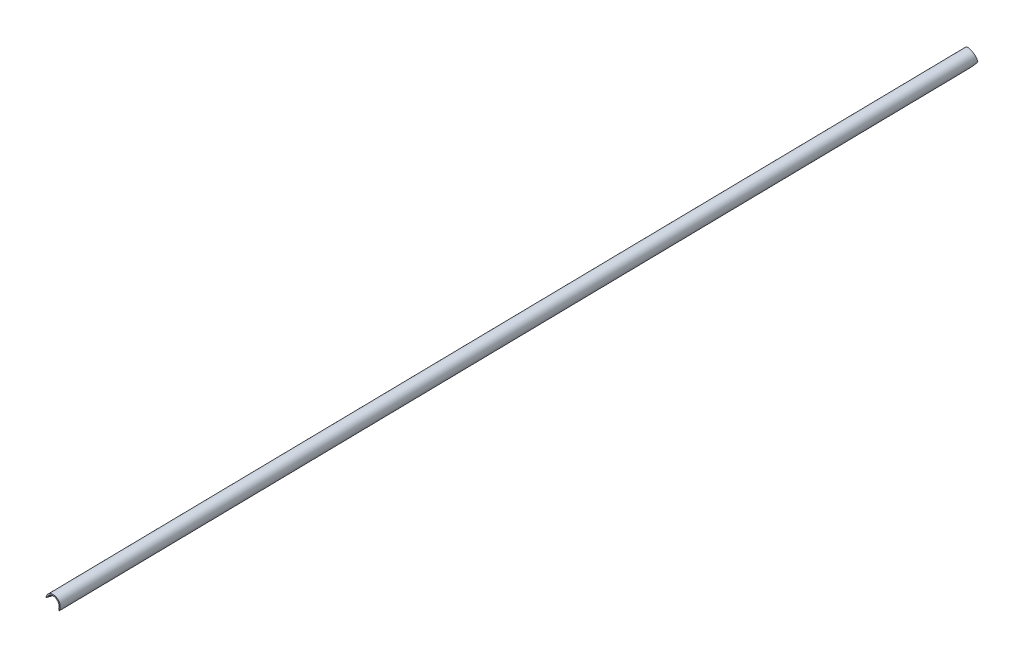
ISO-10303-21;
HEADER;
FILE_DESCRIPTION(('STEP AP214'),'2;1');
FILE_NAME('part.step','',(''),(''),'','','');
FILE_SCHEMA(('AUTOMOTIVE_DESIGN { 1 0 10303 214 1 1 1 1 }'));
ENDSEC;
DATA;
#1=APPLICATION_CONTEXT('core data for automotive mechanical design processes');
#2=APPLICATION_PROTOCOL_DEFINITION('international standard','automotive_design',2000,#1);
#3=PRODUCT_CONTEXT('',#1,'mechanical');
#4=PRODUCT('Part','Part','',(#3));
#5=PRODUCT_RELATED_PRODUCT_CATEGORY('part','',(#4));
#6=PRODUCT_DEFINITION_FORMATION('','',#4);
#7=PRODUCT_DEFINITION_CONTEXT('part definition',#1,'design');
#8=PRODUCT_DEFINITION('design','',#6,#7);
#9=PRODUCT_DEFINITION_SHAPE('','',#8);
#10=(LENGTH_UNIT() NAMED_UNIT(*) SI_UNIT(.MILLI.,.METRE.));
#11=(NAMED_UNIT(*) PLANE_ANGLE_UNIT() SI_UNIT($,.RADIAN.));
#12=(NAMED_UNIT(*) SI_UNIT($,.STERADIAN.) SOLID_ANGLE_UNIT());
#13=UNCERTAINTY_MEASURE_WITH_UNIT(LENGTH_MEASURE(1.E-05),#10,'distance_accuracy_value','');
#14=(GEOMETRIC_REPRESENTATION_CONTEXT(3) GLOBAL_UNCERTAINTY_ASSIGNED_CONTEXT((#13)) GLOBAL_UNIT_ASSIGNED_CONTEXT((#10,
#11,#12)) REPRESENTATION_CONTEXT('',''));
#15=CARTESIAN_POINT('',(0.,0.,0.));
#16=DIRECTION('',(0.,0.,1.));
#17=DIRECTION('',(1.,0.,0.));
#18=AXIS2_PLACEMENT_3D('',#15,#16,#17);
#19=CARTESIAN_POINT('',(325.000000000001,320.,-1580.));
#20=DIRECTION('',(-0.0876619818920292,-0.105194378270435,0.99058039537993));
#21=DIRECTION('',(0.,-0.994408591727349,-0.105600912395825));
#22=AXIS2_PLACEMENT_3D('',#19,#20,#21);
#23=CYLINDRICAL_SURFACE('',#22,7.90000000000002);
#24=CARTESIAN_POINT('',(321.564187869695,308.021197568987,-1542.00957013547));
#25=CARTESIAN_POINT('',(321.513543454168,308.014221116452,-1541.94387154136));
#26=CARTESIAN_POINT('',(321.462273905188,308.007670657862,-1541.87861072624));
#27=CARTESIAN_POINT('',(321.358375195791,307.995510603661,-1541.74908389811));
#28=CARTESIAN_POINT('',(321.305745925539,307.989901084331,-1541.68481796613));
#29=CARTESIAN_POINT('',(321.145587155256,307.974622062816,-1541.4936390251));
#30=CARTESIAN_POINT('',(321.035847760094,307.966510775415,-1541.36842475598));
#31=CARTESIAN_POINT('',(320.810021886063,307.955495394391,-1541.12473709098));
#32=CARTESIAN_POINT('',(320.693970221962,307.952565236482,-1541.00623287388));
#33=CARTESIAN_POINT('',(320.453849860198,307.953258230655,-1540.77775331836));
#34=CARTESIAN_POINT('',(320.329789706347,307.956874506592,-1540.6677691573));
#35=CARTESIAN_POINT('',(320.093766356813,307.971360359894,-1540.47741805793));
#36=CARTESIAN_POINT('',(319.983255633284,307.980914110515,-1540.39517549993));
#37=CARTESIAN_POINT('',(319.754809802187,308.007589782803,-1540.24241845623));
#38=CARTESIAN_POINT('',(319.636862914255,308.024723985584,-1540.17192325866));
#39=CARTESIAN_POINT('',(319.392007604463,308.068811302931,-1540.04684178115));
#40=CARTESIAN_POINT('',(319.264993200791,308.095904603071,-1539.99250372738));
#41=CARTESIAN_POINT('',(319.006087477374,308.161687548452,-1539.90814425322));
#42=CARTESIAN_POINT('',(318.874217781932,308.200330205663,-1539.87802609375));
#43=CARTESIAN_POINT('',(318.646475901313,308.277378620293,-1539.85182899589));
#44=CARTESIAN_POINT('',(318.550472241483,308.313046220552,-1539.84876797863));
#45=CARTESIAN_POINT('',(318.361571674106,308.389830572664,-1539.85928119157));
#46=CARTESIAN_POINT('',(318.268675228716,308.430948130651,-1539.8728578852));
#47=CARTESIAN_POINT('',(318.088959460206,308.516994644617,-1539.91539954483));
#48=CARTESIAN_POINT('',(318.002115050259,308.561905918505,-1539.94429610901));
#49=CARTESIAN_POINT('',(317.835358232615,308.654232636235,-1540.01501749989));
#50=CARTESIAN_POINT('',(317.755450718605,308.70164981055,-1540.0568513599));
#51=CARTESIAN_POINT('',(317.55173564349,308.830017924563,-1540.18220766143));
#52=CARTESIAN_POINT('',(317.434360203123,308.912162946752,-1540.27488799024));
#53=CARTESIAN_POINT('',(317.217294352119,309.077035507662,-1540.47861039872));
#54=CARTESIAN_POINT('',(317.117665485497,309.159764077418,-1540.58971389265));
#55=CARTESIAN_POINT('',(316.911705126935,309.343266534551,-1540.85044749699));
#56=CARTESIAN_POINT('',(316.809055209883,309.443838589794,-1541.00307641182));
#57=CARTESIAN_POINT('',(316.620198248718,309.643205527304,-1541.31943002863));
#58=CARTESIAN_POINT('',(316.534021901744,309.74199678698,-1541.48317468942));
#59=CARTESIAN_POINT('',(316.37412115082,309.938132343311,-1541.81870556109));
#60=CARTESIAN_POINT('',(316.300463496565,310.035466505679,-1541.99052900325));
#61=CARTESIAN_POINT('',(316.163528467873,310.228221840458,-1542.33902831407));
#62=CARTESIAN_POINT('',(316.100242237967,310.323644583143,-1542.51569989115));
#63=CARTESIAN_POINT('',(315.990042685414,310.500082725213,-1542.84855801666));
#64=CARTESIAN_POINT('',(315.942072413931,310.581304003042,-1543.00429012438));
#65=CARTESIAN_POINT('',(315.851496668514,310.742650449879,-1543.31787480215));
#66=CARTESIAN_POINT('',(315.808891682419,310.822775518624,-1543.47572756359));
#67=CARTESIAN_POINT('',(315.687968463006,311.061747060355,-1543.95192964921));
#68=CARTESIAN_POINT('',(315.616586019788,311.2191173018,-1544.27278462225));
#69=CARTESIAN_POINT('',(315.488047359041,311.530942991074,-1544.91948052576));
#70=CARTESIAN_POINT('',(315.430920717273,311.685391774754,-1545.24533035736));
#71=CARTESIAN_POINT('',(315.32835262247,311.99164978551,-1545.9001177331));
#72=CARTESIAN_POINT('',(315.282912452937,312.14345872095,-1546.22905561229));
#73=CARTESIAN_POINT('',(315.201763690695,312.445008275307,-1546.88940315933));
#74=CARTESIAN_POINT('',(315.166063621776,312.594746974432,-1547.2208147331));
#75=CARTESIAN_POINT('',(315.103045408819,312.892404321596,-1547.88525878388));
#76=CARTESIAN_POINT('',(315.075727712541,313.040322872003,-1548.21829134651));
#77=CARTESIAN_POINT('',(315.028457784003,313.334459865675,-1548.88511621988));
#78=CARTESIAN_POINT('',(315.008496304134,313.480680218147,-1549.21890704231));
#79=CARTESIAN_POINT('',(314.975094186203,313.771881457079,-1549.8873542128));
#80=CARTESIAN_POINT('',(314.961653641851,313.916862325698,-1550.22201057322));
#81=CARTESIAN_POINT('',(314.93743575281,314.250377274391,-1550.99522744429));
#82=CARTESIAN_POINT('',(314.92875760826,314.43855591445,-1551.43400702381));
#83=CARTESIAN_POINT('',(314.920452272172,314.813694074632,-1552.31217438879));
#84=CARTESIAN_POINT('',(314.920825277071,315.000653568207,-1552.75156218724));
#85=CARTESIAN_POINT('',(314.929880946846,315.373897161333,-1553.63077183922));
#86=CARTESIAN_POINT('',(314.938567398403,315.560180914277,-1554.0705937993));
#87=CARTESIAN_POINT('',(314.963736332905,315.93245188072,-1554.9501487895));
#88=CARTESIAN_POINT('',(314.980218987057,316.118439087616,-1555.38988181747));
#89=CARTESIAN_POINT('',(315.020655141678,316.490600382779,-1556.26893992611));
#90=CARTESIAN_POINT('',(315.044608871969,316.676774476617,-1556.70826499383));
#91=CARTESIAN_POINT('',(315.09983795457,317.049827048568,-1557.58614575822));
#92=CARTESIAN_POINT('',(315.131113169792,317.236705513427,-1558.02470146914));
#93=CARTESIAN_POINT('',(315.201006217671,317.611706289396,-1558.90052015382));
#94=CARTESIAN_POINT('',(315.239621575935,317.79982816078,-1559.33778351294));
#95=CARTESIAN_POINT('',(315.32443314086,318.17807882493,-1560.2107024008));
#96=CARTESIAN_POINT('',(315.370629238581,318.368207588817,-1560.64635795255));
#97=CARTESIAN_POINT('',(315.459383821423,318.706688723953,-1561.41420813188));
#98=CARTESIAN_POINT('',(315.500281365779,318.854451616527,-1561.74685470869));
#99=CARTESIAN_POINT('',(315.587170451622,319.152128215095,-1562.4105142801));
#100=CARTESIAN_POINT('',(315.633161911114,319.302041886433,-1562.74152730091));
#101=CARTESIAN_POINT('',(315.73076357716,319.604687496808,-1563.40173745229));
#102=CARTESIAN_POINT('',(315.782377918747,319.757421440366,-1563.73093305686));
#103=CARTESIAN_POINT('',(315.891879542648,320.066264186665,-1564.38668700379));
#104=CARTESIAN_POINT('',(315.949766673765,320.222372907988,-1564.71324540952));
#105=CARTESIAN_POINT('',(316.072570248032,320.538285739096,-1565.36196775867));
#106=CARTESIAN_POINT('',(316.13746440642,320.69807693235,-1565.68414216666));
#107=CARTESIAN_POINT('',(316.275733031755,321.022801079188,-1566.32412829168));
#108=CARTESIAN_POINT('',(316.349108549391,321.187734667971,-1566.64193946272));
#109=CARTESIAN_POINT('',(316.506038889183,321.523650259195,-1567.27129662835));
#110=CARTESIAN_POINT('',(316.589580817541,321.694624409104,-1567.58284998688));
#111=CARTESIAN_POINT('',(316.769390293129,322.044064370085,-1568.1979303665));
#112=CARTESIAN_POINT('',(316.86565336107,322.222527529147,-1568.50146016787));
#113=CARTESIAN_POINT('',(317.03977404183,322.527574446397,-1568.99851866715));
#114=CARTESIAN_POINT('',(317.113134273622,322.651714913812,-1569.19511650725));
#115=CARTESIAN_POINT('',(317.268493000282,322.904286038214,-1569.58212025517));
#116=CARTESIAN_POINT('',(317.35049234537,323.03271711661,-1569.77252555113));
#117=CARTESIAN_POINT('',(317.524698031063,323.293938942804,-1570.14537343875));
#118=CARTESIAN_POINT('',(317.616898199481,323.426727020475,-1570.32782075334));
#119=CARTESIAN_POINT('',(317.81343817277,323.696571170977,-1570.68279472544));
#120=CARTESIAN_POINT('',(317.917775875304,323.833626501678,-1570.85532309329));
#121=CARTESIAN_POINT('',(318.122136424406,324.088218207165,-1571.16034427286));
#122=CARTESIAN_POINT('',(318.219998050788,324.20521601251,-1571.29472745451));
#123=CARTESIAN_POINT('',(318.426758284277,324.440811776597,-1571.55325905881));
#124=CARTESIAN_POINT('',(318.535655968938,324.559409600886,-1571.67740833529));
#125=CARTESIAN_POINT('',(318.765292062153,324.796673096401,-1571.91369168391));
#126=CARTESIAN_POINT('',(318.886012764027,324.915338409366,-1572.02584321286));
#127=CARTESIAN_POINT('',(319.140008763392,325.151013733521,-1572.23694344895));
#128=CARTESIAN_POINT('',(319.273283453184,325.26802382452,-1572.33589279461));
#129=CARTESIAN_POINT('',(319.553733775096,325.499133455894,-1572.52053018726));
#130=CARTESIAN_POINT('',(319.701026773492,325.61319597946,-1572.60608685549));
#131=CARTESIAN_POINT('',(320.007889453049,325.834663177607,-1572.76259115367));
#132=CARTESIAN_POINT('',(320.167459630508,325.942067582718,-1572.8335381926));
#133=CARTESIAN_POINT('',(320.497891077838,326.147767991254,-1572.96140574872));
#134=CARTESIAN_POINT('',(320.668761405106,326.246056532685,-1573.018314837));
#135=CARTESIAN_POINT('',(321.020202385543,326.431223479711,-1573.11921295468));
#136=CARTESIAN_POINT('',(321.200772684393,326.51810230168,-1573.16320245564));
#137=CARTESIAN_POINT('',(321.546012402957,326.668295048512,-1573.234879743));
#138=CARTESIAN_POINT('',(321.709709791061,326.733203749989,-1573.26394136073));
#139=CARTESIAN_POINT('',(322.042083429175,326.852202879338,-1573.31463028091));
#140=CARTESIAN_POINT('',(322.210759068786,326.906294627239,-1573.33625849072));
#141=CARTESIAN_POINT('',(322.552028773075,327.003042671768,-1573.37322280117));
#142=CARTESIAN_POINT('',(322.724622966439,327.045698592253,-1573.38855869485));
#143=CARTESIAN_POINT('',(323.072700638628,327.119149581876,-1573.41400563133));
#144=CARTESIAN_POINT('',(323.248184361263,327.149943644742,-1573.42411623088));
#145=CARTESIAN_POINT('',(323.618916948884,327.201897996129,-1573.44087886656));
#146=CARTESIAN_POINT('',(323.814368052329,327.221767177884,-1573.44707707375));
#147=CARTESIAN_POINT('',(324.206299539592,327.246591259928,-1573.45540559328));
#148=CARTESIAN_POINT('',(324.402779971725,327.251545453731,-1573.45753571291));
#149=CARTESIAN_POINT('',(324.795608390269,327.24648913895,-1573.45864507169));
#150=CARTESIAN_POINT('',(324.99195632618,327.236474563523,-1573.45762345447));
#151=CARTESIAN_POINT('',(325.383299993875,327.201537845056,-1573.45316336426));
#152=CARTESIAN_POINT('',(325.578295635871,327.176614721539,-1573.44972473231));
#153=CARTESIAN_POINT('',(325.981389279367,327.109417756135,-1573.44064491127));
#154=CARTESIAN_POINT('',(326.189278917805,327.065909066979,-1573.4348487462));
#155=CARTESIAN_POINT('',(326.600740101494,326.961983640292,-1573.42159740695));
#156=CARTESIAN_POINT('',(326.804311413161,326.901565990624,-1573.41414214328));
#157=CARTESIAN_POINT('',(327.205795045977,326.764231687664,-1573.3978631139));
#158=CARTESIAN_POINT('',(327.403706372238,326.687312153699,-1573.38903910932));
#159=CARTESIAN_POINT('',(327.792488360085,326.517504976575,-1573.37011409738));
#160=CARTESIAN_POINT('',(327.98335910511,326.42461752273,-1573.36001310516));
#161=CARTESIAN_POINT('',(328.360986058217,326.221217885586,-1573.33817892485));
#162=CARTESIAN_POINT('',(328.547551337852,326.110354351985,-1573.32641396676));
#163=CARTESIAN_POINT('',(328.910594779935,325.873355539938,-1573.30109152471));
#164=CARTESIAN_POINT('',(329.087072702476,325.747219898498,-1573.28753399815));
#165=CARTESIAN_POINT('',(329.428659309695,325.480545928243,-1573.25804376897));
#166=CARTESIAN_POINT('',(329.593764914255,325.340003722949,-1573.24211042655));
#167=CARTESIAN_POINT('',(329.91126931104,325.045592121219,-1573.20703909769));
#168=CARTESIAN_POINT('',(330.063668281149,324.891722911413,-1573.18790115612));
#169=CARTESIAN_POINT('',(330.353262921375,324.573266796481,-1573.14550301834));
#170=CARTESIAN_POINT('',(330.490579411069,324.4087848734,-1573.1222801648));
#171=CARTESIAN_POINT('',(330.750388615195,324.069310299793,-1573.07025347427));
#172=CARTESIAN_POINT('',(330.872881151618,323.894317523088,-1573.04144957027));
#173=CARTESIAN_POINT('',(331.101938508419,323.535595033034,-1572.97667163206));
#174=CARTESIAN_POINT('',(331.208513033488,323.351870733825,-1572.94070199803));
#175=CARTESIAN_POINT('',(331.404949176079,322.977586653669,-1572.85976331191));
#176=CARTESIAN_POINT('',(331.494812295126,322.787027488674,-1572.81479506911));
#177=CARTESIAN_POINT('',(331.652082451343,322.413672429715,-1572.71714478522));
#178=CARTESIAN_POINT('',(331.720551251046,322.231149208463,-1572.66513165122));
#179=CARTESIAN_POINT('',(331.842122631752,321.864469750331,-1572.55005424079));
#180=CARTESIAN_POINT('',(331.895226480895,321.680313649513,-1572.48699087708));
#181=CARTESIAN_POINT('',(331.986250584922,321.313083456584,-1572.34871947004));
#182=CARTESIAN_POINT('',(332.024190076921,321.130008285731,-1572.27352698455));
#183=CARTESIAN_POINT('',(332.085710710003,320.76722318045,-1572.11027895624));
#184=CARTESIAN_POINT('',(332.109292952347,320.587512988938,-1572.02222440064));
#185=CARTESIAN_POINT('',(332.141429611617,320.253466077736,-1571.84380576389));
#186=CARTESIAN_POINT('',(332.151366525948,320.098534531157,-1571.75479408003));
#187=CARTESIAN_POINT('',(332.1619915009,319.794374363361,-1571.56706598546));
#188=CARTESIAN_POINT('',(332.1626803894,319.64514523286,-1571.46835044423));
#189=CARTESIAN_POINT('',(332.156045152388,319.353158216363,-1571.26190952918));
#190=CARTESIAN_POINT('',(332.148716977445,319.210403638619,-1571.15417962758));
#191=CARTESIAN_POINT('',(332.127288304009,318.931863552971,-1570.93070559392));
#192=CARTESIAN_POINT('',(332.113186882404,318.796078997791,-1570.8149603713));
#193=CARTESIAN_POINT('',(332.067631557903,318.439498439106,-1570.49346594702));
#194=CARTESIAN_POINT('',(332.030930838373,318.225290381515,-1570.28112893585));
#195=CARTESIAN_POINT('',(331.946209786786,317.815791174138,-1569.84102998402));
#196=CARTESIAN_POINT('',(331.898180408297,317.62051531931,-1569.61325582025));
#197=CARTESIAN_POINT('',(331.794038204674,317.245929653157,-1569.14542623803));
#198=CARTESIAN_POINT('',(331.737897345898,317.066678853835,-1568.9053301706));
#199=CARTESIAN_POINT('',(331.649477106135,316.808532722333,-1568.5388292938));
#200=CARTESIAN_POINT('',(331.61930705665,316.724284225382,-1568.41562188747));
#201=CARTESIAN_POINT('',(331.557757375531,316.559044462794,-1568.1673374967));
#202=CARTESIAN_POINT('',(331.526377755044,316.478053167153,-1568.0422605295));
#203=CARTESIAN_POINT('',(331.437367622877,316.256184353928,-1567.69095521208));
#204=CARTESIAN_POINT('',(331.378598280031,316.118588184516,-1567.4629412853));
#205=CARTESIAN_POINT('',(331.258476194728,315.85151363114,-1567.00285597572));
#206=CARTESIAN_POINT('',(331.197123024413,315.722036600541,-1566.77078392469));
#207=CARTESIAN_POINT('',(331.072286357989,315.469965686755,-1566.30332556274));
#208=CARTESIAN_POINT('',(331.008801657322,315.347375803864,-1566.06793742299));
#209=CARTESIAN_POINT('',(330.880053164849,315.108184790669,-1565.59461147982));
#210=CARTESIAN_POINT('',(330.814789256129,314.991584055379,-1565.35667350946));
#211=CARTESIAN_POINT('',(330.616322819389,314.648930110786,-1564.63856758879));
#212=CARTESIAN_POINT('',(330.480772069463,314.430670349047,-1564.15532626035));
#213=CARTESIAN_POINT('',(330.204378905212,314.010134001396,-1563.18370279125));
#214=CARTESIAN_POINT('',(330.063538116202,313.80785256461,-1562.69532226221));
#215=CARTESIAN_POINT('',(329.775122299999,313.413731675732,-1561.70943275338));
#216=CARTESIAN_POINT('',(329.627488906957,313.222037120707,-1561.21188312223));
#217=CARTESIAN_POINT('',(329.326912795904,312.849297399978,-1560.21437735228));
#218=CARTESIAN_POINT('',(329.173969697547,312.668252999683,-1559.7144210433));
#219=CARTESIAN_POINT('',(328.862871268123,312.315692335021,-1558.71426500678));
#220=CARTESIAN_POINT('',(328.704729530162,312.144153951102,-1558.21406883383));
#221=CARTESIAN_POINT('',(328.382447783288,311.809095498745,-1557.21295171291));
#222=CARTESIAN_POINT('',(328.218308003636,311.645575124394,-1556.71203079334));
#223=CARTESIAN_POINT('',(327.846323760179,311.290427153308,-1555.59895534249));
#224=CARTESIAN_POINT('',(327.636858433962,311.100606654899,-1554.98676426909));
#225=CARTESIAN_POINT('',(327.206721674541,310.731285949181,-1553.76311382535));
#226=CARTESIAN_POINT('',(326.986048957882,310.551786928915,-1553.15165454705));
#227=CARTESIAN_POINT('',(326.530621627523,310.202306036228,-1551.92772169402));
#228=CARTESIAN_POINT('',(326.295805322087,310.032373215892,-1551.31525701031));
#229=CARTESIAN_POINT('',(325.810617026582,309.703610895858,-1550.09371762461));
#230=CARTESIAN_POINT('',(325.560250384558,309.544777618326,-1549.48464183477));
#231=CARTESIAN_POINT('',(325.172463319723,309.31721707057,-1548.57998368413));
#232=CARTESIAN_POINT('',(325.04233872623,309.243736294681,-1548.28246082786));
#233=CARTESIAN_POINT('',(324.77683950109,309.100093673557,-1547.68896170502));
#234=CARTESIAN_POINT('',(324.641465002424,309.029931744354,-1547.39298539949));
#235=CARTESIAN_POINT('',(324.364554982941,308.893202722581,-1546.80255747249));
#236=CARTESIAN_POINT('',(324.2230111232,308.826640786421,-1546.50810855708));
#237=CARTESIAN_POINT('',(323.933024597292,308.69773689938,-1545.92170811541));
#238=CARTESIAN_POINT('',(323.784582400933,308.635394661828,-1545.62975642068));
#239=CARTESIAN_POINT('',(323.480742683189,308.516089693004,-1545.05127527231));
#240=CARTESIAN_POINT('',(323.32540641623,308.459089765056,-1544.76472149214));
#241=CARTESIAN_POINT('',(323.005188158047,308.350941212668,-1544.19590287779));
#242=CARTESIAN_POINT('',(322.840307448922,308.299791805066,-1543.91363747396));
#243=CARTESIAN_POINT('',(322.499169697861,308.204878715527,-1543.35557309317));
#244=CARTESIAN_POINT('',(322.322938885637,308.161098793819,-1543.07976108232));
#245=CARTESIAN_POINT('',(322.047520352362,308.102602026855,-1542.67262442792));
#246=CARTESIAN_POINT('',(321.953895806526,308.084302633829,-1542.5380448781));
#247=CARTESIAN_POINT('',(321.762394139002,308.050511032186,-1542.27159451607));
#248=CARTESIAN_POINT('',(321.664517708531,308.03501836939,-1542.13972326867));
#249=CARTESIAN_POINT('',(321.564187869695,308.021197568987,-1542.00957013547));
#250=B_SPLINE_CURVE_WITH_KNOTS('',3,(#24,#25,#26,#27,#28,#29,#30,#31,#32,#33,#34,#35,#36,#37,
#38,#39,#40,#41,#42,#43,#44,#45,#46,#47,#48,#49,#50,#51,#52,#53,#54,#55,#56,#57,#58,#59,#60,#61,
#62,#63,#64,#65,#66,#67,#68,#69,#70,#71,#72,#73,#74,#75,#76,#77,#78,#79,#80,#81,#82,#83,#84,#85,
#86,#87,#88,#89,#90,#91,#92,#93,#94,#95,#96,#97,#98,#99,#100,#101,#102,#103,#104,#105,#106,#107,
#108,#109,#110,#111,#112,#113,#114,#115,#116,#117,#118,#119,#120,#121,#122,#123,#124,#125,#126,
#127,#128,#129,#130,#131,#132,#133,#134,#135,#136,#137,#138,#139,#140,#141,#142,#143,#144,#145,
#146,#147,#148,#149,#150,#151,#152,#153,#154,#155,#156,#157,#158,#159,#160,#161,#162,#163,#164,
#165,#166,#167,#168,#169,#170,#171,#172,#173,#174,#175,#176,#177,#178,#179,#180,#181,#182,#183,
#184,#185,#186,#187,#188,#189,#190,#191,#192,#193,#194,#195,#196,#197,#198,#199,#200,#201,#202,
#203,#204,#205,#206,#207,#208,#209,#210,#211,#212,#213,#214,#215,#216,#217,#218,#219,#220,#221,
#222,#223,#224,#225,#226,#227,#228,#229,#230,#231,#232,#233,#234,#235,#236,#237,#238,#239,#240,
#241,#242,#243,#244,#245,#246,#247,#248,#249),.UNSPECIFIED.,.T.,.F.,(4,2,2,2,2,2,2,2,2,2,2,2,2,
2,2,2,2,2,2,2,2,2,2,2,2,2,2,2,2,2,2,2,2,2,2,2,2,2,2,2,2,2,2,2,2,2,2,2,2,2,2,2,2,2,2,2,2,2,2,2,2,
2,2,2,2,2,2,2,2,2,2,2,2,2,2,2,2,2,2,2,2,2,2,2,2,2,2,2,2,2,2,2,2,2,2,2,2,2,2,2,2,2,2,2,2,2,2,2,2,
2,2,2,4),(0.,0.249728036450129,0.499476308654394,0.999275314555785,1.49655279144428,
1.99330824859594,2.4068900540006,2.82114437225205,3.24146822330487,3.66010476030913,
3.96601280278646,4.27196614448551,4.57656479653522,4.88137661287255,5.39029006827179,
5.90093542784693,6.52841145810188,7.15704557760979,7.78893302160761,8.42027809574031,
8.96638972724482,9.51255097831173,10.6053591827544,11.7004160747855,12.7955931833669,
13.8917256550476,14.9879166684152,16.082724904601,17.17754887346,18.6099697397214,
20.0424216935141,21.4755264234714,22.9086626265583,24.3418429197438,25.7749963801946,
27.2076675727299,28.6403181786129,29.7391159864219,30.8378961094685,31.9374897938811,
33.0370569799825,34.1332247954645,35.2295285524942,36.324456109562,37.4189991497908,
38.1502142289447,38.8815013381622,39.6123483645773,40.3430689893401,40.9524332220365,
41.5617465631288,42.1701609319484,42.7785458644228,43.3925682482619,44.006615466726,
44.6211609710481,45.2356840425965,45.7705669541281,46.3053845521692,46.8402197390384,
47.3751002873282,47.9641374861941,48.5532025858824,49.1424277569581,49.7316916833762,
50.368374679728,51.0050920279338,51.6419206160964,52.2787416545863,52.9299773654715,
53.581228558217,54.2326554500919,54.8840732208771,55.5298191961619,56.1755729249495,
56.8209313375694,57.466231736518,58.0706634034549,58.6750451696651,59.2786577805417,
59.8822240859566,60.4184881019122,60.9547041115219,61.4911910897476,62.0277512054728,
62.9376524180696,63.8482827014683,64.7621389827987,65.2189296903869,65.6757161892342,
66.4936643476954,67.3117484879434,68.1303029890001,68.9489114086634,70.5903754383555,
72.231339203884,73.8909630602108,75.5507060454525,77.2064090932839,78.8620489216377,
80.8847924835631,82.9077682119809,84.940316233929,86.972169055307,87.9709521431954,
88.9697099479165,89.9698623566726,90.9699467501722,91.962450057844,92.9548203512293,
93.9449743362285,94.4397817510622,94.9345090253153),.UNSPECIFIED.);
#251=CARTESIAN_POINT('',(321.564187869695,308.021197568987,-1542.00957013547));
#252=VERTEX_POINT('',#251);
#253=EDGE_CURVE('E124',#252,#252,#250,.T.);
#254=ORIENTED_EDGE('',*,*,#253,.T.);
#255=EDGE_LOOP('',(#254));
#256=FACE_BOUND('',#255,.T.);
#257=CARTESIAN_POINT('',(225.884955752213,201.061946902655,-460.));
#258=DIRECTION('',(0.,0.,1.));
#259=DIRECTION('',(-0.64018439966448,-0.768221279597376,0.));
#260=AXIS2_PLACEMENT_3D('',#257,#258,#259);
#261=ELLIPSE('',#260,7.97512250075374,7.90000000000002);
#262=CARTESIAN_POINT('',(233.371576529843,198.510289785328,-460.));
#263=VERTEX_POINT('',#262);
#264=CARTESIAN_POINT('',(228.287101584349,208.655265374027,-460.));
#265=VERTEX_POINT('',#264);
#266=EDGE_CURVE('E172',#263,#265,#261,.T.);
#267=ORIENTED_EDGE('',*,*,#266,.T.);
#268=CARTESIAN_POINT('',(225.884669913097,201.061603895716,-459.996770017996));
#269=DIRECTION('',(-0.00725504842418489,0.00272064315906934,0.999969980736004));
#270=DIRECTION('',(-0.597881758815907,-0.801581405859209,-0.00215690889267566));
#271=AXIS2_PLACEMENT_3D('',#268,#269,#270);
#272=ELLIPSE('',#271,7.97254655053792,7.90000000000002);
#273=CARTESIAN_POINT('',(218.844081113047,204.648893932802,-460.057611393187));
#274=VERTEX_POINT('',#273);
#275=EDGE_CURVE('E56',#265,#274,#272,.T.);
#276=ORIENTED_EDGE('',*,*,#275,.T.);
#277=CARTESIAN_POINT('',(227.879875160685,195.600022318175,-483.37683652366));
#278=CARTESIAN_POINT('',(228.004671320406,195.579137566829,-483.180197049402));
#279=CARTESIAN_POINT('',(228.123158804345,195.561599365298,-482.979210532546));
#280=CARTESIAN_POINT('',(228.349891905065,195.531882544435,-482.571110453454));
#281=CARTESIAN_POINT('',(228.458132328555,195.519706631459,-482.363993853501));
#282=CARTESIAN_POINT('',(228.666236117037,195.499775819601,-481.944966789839));
#283=CARTESIAN_POINT('',(228.766084692933,195.49202859166,-481.733048665285));
#284=CARTESIAN_POINT('',(228.958533927525,195.480302152532,-481.305838512168));
#285=CARTESIAN_POINT('',(229.051133780722,195.476323359562,-481.090546111828));
#286=CARTESIAN_POINT('',(229.23048792064,195.471616224704,-480.656422348112));
#287=CARTESIAN_POINT('',(229.317215071274,195.470902075661,-480.437579675235));
#288=CARTESIAN_POINT('',(229.485199626099,195.472372141335,-479.997815457106));
#289=CARTESIAN_POINT('',(229.566456847608,195.474556452802,-479.776893842703));
#290=CARTESIAN_POINT('',(229.724061708732,195.481519231398,-479.333635082203));
#291=CARTESIAN_POINT('',(229.800414815429,195.486294751686,-479.111299827081));
#292=CARTESIAN_POINT('',(229.948838853258,195.498205906946,-478.665272527085));
#293=CARTESIAN_POINT('',(230.020909781815,195.505341543337,-478.441580481395));
#294=CARTESIAN_POINT('',(230.182782041111,195.524318178137,-477.924114342372));
#295=CARTESIAN_POINT('',(230.271220489142,195.536931359024,-477.629942070482));
#296=CARTESIAN_POINT('',(230.44232099785,195.565574498125,-477.040082854735));
#297=CARTESIAN_POINT('',(230.524982756158,195.581604635014,-476.74439583246));
#298=CARTESIAN_POINT('',(230.765315768115,195.634482834515,-475.855437408489));
#299=CARTESIAN_POINT('',(230.915305824709,195.67611508364,-475.260362774387));
#300=CARTESIAN_POINT('',(231.198858462203,195.771231306731,-474.066343300557));
#301=CARTESIAN_POINT('',(231.332395442078,195.824733396825,-473.46739391839));
#302=CARTESIAN_POINT('',(231.585472035765,195.943432221648,-472.267780344959));
#303=CARTESIAN_POINT('',(231.705013203768,196.008627655828,-471.667116351701));
#304=CARTESIAN_POINT('',(231.931816150699,196.151123619139,-470.466759096323));
#305=CARTESIAN_POINT('',(232.039112870386,196.228388133155,-469.867068144048));
#306=CARTESIAN_POINT('',(232.243384468338,196.396617308261,-468.667779488521));
#307=CARTESIAN_POINT('',(232.340358210598,196.48758347451,-468.068181802767));
#308=CARTESIAN_POINT('',(232.525046935899,196.685604807839,-466.870978495038));
#309=CARTESIAN_POINT('',(232.612773615124,196.79263922498,-466.273371305406));
#310=CARTESIAN_POINT('',(232.738111139114,196.96848381587,-465.379159104757));
#311=CARTESIAN_POINT('',(232.778845223574,197.02964200464,-465.08147852066));
#312=CARTESIAN_POINT('',(232.858280404766,197.157838201048,-464.487118564711));
#313=CARTESIAN_POINT('',(232.89698160437,197.224875910701,-464.190439142909));
#314=CARTESIAN_POINT('',(232.957156169495,197.337374294292,-463.717829069959));
#315=CARTESIAN_POINT('',(232.97928262554,197.380632987131,-463.541456547258));
#316=CARTESIAN_POINT('',(233.022800159708,197.469842131628,-463.189305093981));
#317=CARTESIAN_POINT('',(233.044191242708,197.515792565425,-463.013526159473));
#318=CARTESIAN_POINT('',(233.107242097088,197.658119253209,-462.487177894305));
#319=CARTESIAN_POINT('',(233.147771905202,197.758956949662,-462.137656529043));
#320=CARTESIAN_POINT('',(233.225421944969,197.975385245172,-461.442844624762));
#321=CARTESIAN_POINT('',(233.262542650971,198.090973786393,-461.097553502948));
#322=CARTESIAN_POINT('',(233.332540012935,198.34078322378,-460.4133264598));
#323=CARTESIAN_POINT('',(233.365418088825,198.474997854769,-460.07438844483));
#324=CARTESIAN_POINT('',(233.415233861065,198.718343084689,-459.517967646428));
#325=CARTESIAN_POINT('',(233.433826560755,198.820864980245,-459.297752671173));
#326=CARTESIAN_POINT('',(233.467528995516,199.038271269937,-458.863146490535));
#327=CARTESIAN_POINT('',(233.482638408607,199.153156805475,-458.648755825139));
#328=CARTESIAN_POINT('',(233.508117056081,199.39691954672,-458.228316861114));
#329=CARTESIAN_POINT('',(233.51849613432,199.525766999091,-458.02225205883));
#330=CARTESIAN_POINT('',(233.532823742381,199.799378517133,-457.620715683068));
#331=CARTESIAN_POINT('',(233.536775035325,199.944135715079,-457.425239592761));
#332=CARTESIAN_POINT('',(233.536055220171,200.210059880549,-457.098039847558));
#333=CARTESIAN_POINT('',(233.533390125932,200.327324419325,-456.963140308804));
#334=CARTESIAN_POINT('',(233.522251327913,200.571040085457,-456.702191361863));
#335=CARTESIAN_POINT('',(233.513779438434,200.697488332381,-456.576139202917));
#336=CARTESIAN_POINT('',(233.489886789584,200.959006526346,-456.334257417812));
#337=CARTESIAN_POINT('',(233.474472591517,201.094068229424,-456.218418262482));
#338=CARTESIAN_POINT('',(233.435572087802,201.371905218456,-455.997855450474));
#339=CARTESIAN_POINT('',(233.412085791844,201.514680495151,-455.893131780454));
#340=CARTESIAN_POINT('',(233.35596674235,201.806901267464,-455.69508750025));
#341=CARTESIAN_POINT('',(233.323305118884,201.956366544473,-455.601804239911));
#342=CARTESIAN_POINT('',(233.248100557501,202.259688777833,-455.427120257232));
#343=CARTESIAN_POINT('',(233.205557246419,202.413545899841,-455.345719983818));
#344=CARTESIAN_POINT('',(233.110037349547,202.72384203893,-455.194324272965));
#345=CARTESIAN_POINT('',(233.057048396364,202.88028391317,-455.124342536067));
#346=CARTESIAN_POINT('',(232.940429120611,203.193629819652,-454.995139673955));
#347=CARTESIAN_POINT('',(232.87679859573,203.350533860625,-454.935918753363));
#348=CARTESIAN_POINT('',(232.740889491057,203.658463875603,-454.828848452437));
#349=CARTESIAN_POINT('',(232.668917027466,203.809527881712,-454.780717940536));
#350=CARTESIAN_POINT('',(232.515061741253,204.10897114753,-454.692717652163));
#351=CARTESIAN_POINT('',(232.433179288333,204.257350507155,-454.652847567677));
#352=CARTESIAN_POINT('',(232.259749276358,204.550178074239,-454.580417743029));
#353=CARTESIAN_POINT('',(232.168201939489,204.694626371972,-454.547857834868));
#354=CARTESIAN_POINT('',(231.975764238528,204.978526869097,-454.489163102721));
#355=CARTESIAN_POINT('',(231.874872873566,205.117978531058,-454.463028968121));
#356=CARTESIAN_POINT('',(231.6486420027,205.411014127098,-454.412969317045));
#357=CARTESIAN_POINT('',(231.521888958442,205.563661183328,-454.389933535301));
#358=CARTESIAN_POINT('',(231.257286479386,205.859903945908,-454.350256586792));
#359=CARTESIAN_POINT('',(231.119436189168,206.003498952965,-454.333615913562));
#360=CARTESIAN_POINT('',(230.833337777403,206.28062748139,-454.305879557774));
#361=CARTESIAN_POINT('',(230.685085358297,206.41415679637,-454.294786182607));
#362=CARTESIAN_POINT('',(230.379057488937,206.67015873721,-454.277474480737));
#363=CARTESIAN_POINT('',(230.221281794606,206.792631079483,-454.271256279039));
#364=CARTESIAN_POINT('',(229.883513657704,207.035465937267,-454.262826583987));
#365=CARTESIAN_POINT('',(229.70276691508,207.154794319958,-454.260993911563));
#366=CARTESIAN_POINT('',(229.332317273562,207.378621780032,-454.261941418871));
#367=CARTESIAN_POINT('',(229.142613856557,207.483119998143,-454.264721865774));
#368=CARTESIAN_POINT('',(228.755506638918,207.676539578431,-454.274583997759));
#369=CARTESIAN_POINT('',(228.558102019993,207.765459279771,-454.281666141089));
#370=CARTESIAN_POINT('',(228.156952900672,207.927087396978,-454.299986403088));
#371=CARTESIAN_POINT('',(227.9532084144,207.999795848958,-454.311224512497));
#372=CARTESIAN_POINT('',(227.536786746942,208.129762992837,-454.338133276653));
#373=CARTESIAN_POINT('',(227.324013020388,208.186695782073,-454.353885433398));
#374=CARTESIAN_POINT('',(226.894873190653,208.28284843629,-454.389926777339));
#375=CARTESIAN_POINT('',(226.678507014121,208.322067939135,-454.41021605728));
#376=CARTESIAN_POINT('',(226.243748794713,208.382588654899,-454.455727157057));
#377=CARTESIAN_POINT('',(226.025356350674,208.40388623963,-454.480949974386));
#378=CARTESIAN_POINT('',(225.588264677258,208.42850529748,-454.536924933487));
#379=CARTESIAN_POINT('',(225.369565450259,208.431826909197,-454.567677032625));
#380=CARTESIAN_POINT('',(224.9344206306,208.420656159588,-454.635414064946));
#381=CARTESIAN_POINT('',(224.717969679124,208.406230069834,-454.672375368425));
#382=CARTESIAN_POINT('',(224.288316056273,208.36002658035,-454.753681185796));
#383=CARTESIAN_POINT('',(224.075113440326,208.328248884877,-454.798025825522));
#384=CARTESIAN_POINT('',(223.653887084035,208.247951459497,-454.895434917028));
#385=CARTESIAN_POINT('',(223.445863657163,208.199430718842,-454.948499895137));
#386=CARTESIAN_POINT('',(223.037098097258,208.08659209161,-455.064936645584));
#387=CARTESIAN_POINT('',(222.836355541288,208.022275124311,-455.128307818068));
#388=CARTESIAN_POINT('',(222.453626490695,207.882597271873,-455.263866427784));
#389=CARTESIAN_POINT('',(222.271201916437,207.807899407982,-455.335497887594));
#390=CARTESIAN_POINT('',(221.91704049641,207.647069234876,-455.491314826126));
#391=CARTESIAN_POINT('',(221.74530307872,207.560937538311,-455.575499632242));
#392=CARTESIAN_POINT('',(221.414927685587,207.379607112023,-455.757611216089));
#393=CARTESIAN_POINT('',(221.256261825033,207.284428668263,-455.855507471141));
#394=CARTESIAN_POINT('',(220.95348331679,207.087505176381,-456.06606874605));
#395=CARTESIAN_POINT('',(220.80936772648,206.985761462858,-456.178730769071));
#396=CARTESIAN_POINT('',(220.556696329381,206.793618364642,-456.401576443124));
#397=CARTESIAN_POINT('',(220.446010240311,206.703700995782,-456.509771077603));
#398=CARTESIAN_POINT('',(220.236671427698,206.52305822359,-456.736581639097));
#399=CARTESIAN_POINT('',(220.138017197882,206.432332922932,-456.855196258425));
#400=CARTESIAN_POINT('',(219.952642023822,206.251672823569,-457.102009651441));
#401=CARTESIAN_POINT('',(219.865924574199,206.161738263545,-457.230211214929));
#402=CARTESIAN_POINT('',(219.703933381008,205.983957927083,-457.495003370171));
#403=CARTESIAN_POINT('',(219.628661552559,205.896112502275,-457.631595360482));
#404=CARTESIAN_POINT('',(219.458149941286,205.685669220708,-457.97314345312));
#405=CARTESIAN_POINT('',(219.368552217105,205.564654314354,-458.1818971075));
#406=CARTESIAN_POINT('',(219.208146655964,205.330062275034,-458.610483865001));
#407=CARTESIAN_POINT('',(219.137349540594,205.216489413795,-458.830323205394));
#408=CARTESIAN_POINT('',(219.011139533664,204.996470772746,-459.27893403088));
#409=CARTESIAN_POINT('',(218.955789382673,204.890055354157,-459.507737759012));
#410=CARTESIAN_POINT('',(218.88248820244,204.735788055176,-459.855247286968));
#411=CARTESIAN_POINT('',(218.859676450959,204.685261727879,-459.971792517182));
#412=CARTESIAN_POINT('',(218.816988144113,204.585882930873,-460.206131231624));
#413=CARTESIAN_POINT('',(218.797111606204,204.537030471121,-460.32392472327));
#414=CARTESIAN_POINT('',(218.749245399211,204.41298965242,-460.629268185363));
#415=CARTESIAN_POINT('',(218.723245899075,204.338979355927,-460.817609468191));
#416=CARTESIAN_POINT('',(218.676959955035,204.194469972922,-461.196339685576));
#417=CARTESIAN_POINT('',(218.656674322461,204.123971386218,-461.386728906946));
#418=CARTESIAN_POINT('',(218.603196688184,203.917059222095,-461.960441112736));
#419=CARTESIAN_POINT('',(218.577409030975,203.78529732299,-462.34613829528));
#420=CARTESIAN_POINT('',(218.541020073936,203.531027824341,-463.122143227347));
#421=CARTESIAN_POINT('',(218.530453618878,203.40854206482,-463.512459499934));
#422=CARTESIAN_POINT('',(218.521678277668,203.170854916297,-464.295306141626));
#423=CARTESIAN_POINT('',(218.523466273852,203.05565169694,-464.687835927166));
#424=CARTESIAN_POINT('',(218.537465028041,202.830197221462,-465.475963436788));
#425=CARTESIAN_POINT('',(218.549721347975,202.719969833278,-465.871567069955));
#426=CARTESIAN_POINT('',(218.583415843275,202.503568911363,-466.663502240481));
#427=CARTESIAN_POINT('',(218.604854507152,202.39739559364,-467.05983381545));
#428=CARTESIAN_POINT('',(218.656041652837,202.18811621115,-467.852197641378));
#429=CARTESIAN_POINT('',(218.685779066166,202.085006261903,-468.248229591304));
#430=CARTESIAN_POINT('',(218.753072236523,201.880798059043,-469.040135262593));
#431=CARTESIAN_POINT('',(218.790627821671,201.779699761257,-469.436008987243));
#432=CARTESIAN_POINT('',(218.870310301277,201.586046303889,-470.198582901534));
#433=CARTESIAN_POINT('',(218.911908003097,201.493403391452,-470.565316314824));
#434=CARTESIAN_POINT('',(219.001577076091,201.308677985159,-471.298138305776));
#435=CARTESIAN_POINT('',(219.049648538117,201.216595499186,-471.664226874315));
#436=CARTESIAN_POINT('',(219.152383365304,201.032488641995,-472.395666167897));
#437=CARTESIAN_POINT('',(219.207049590392,200.940464313513,-472.761016502457));
#438=CARTESIAN_POINT('',(219.323187283355,200.756084404552,-473.490549503156));
#439=CARTESIAN_POINT('',(219.384658701316,200.663728826508,-473.85473217784));
#440=CARTESIAN_POINT('',(219.514623329028,200.478491162306,-474.580760039419));
#441=CARTESIAN_POINT('',(219.583099464302,200.38561085428,-474.942608727847));
#442=CARTESIAN_POINT('',(219.727719649254,200.198693300531,-475.664461425546));
#443=CARTESIAN_POINT('',(219.803863423873,200.104656096415,-476.024465500501));
#444=CARTESIAN_POINT('',(219.964512660161,199.915016339919,-476.742046784129));
#445=CARTESIAN_POINT('',(220.049014997165,199.819414383557,-477.099624846697));
#446=CARTESIAN_POINT('',(220.227370082236,199.626129724583,-477.811858914783));
#447=CARTESIAN_POINT('',(220.321222187669,199.528447165338,-478.166515119318));
#448=CARTESIAN_POINT('',(220.519928727822,199.330090966794,-478.873304126074));
#449=CARTESIAN_POINT('',(220.624819415536,199.229408302752,-479.225424282215));
#450=CARTESIAN_POINT('',(220.847183058749,199.024646906382,-479.924795780788));
#451=CARTESIAN_POINT('',(220.964659083743,198.920567349896,-480.272045911988));
#452=CARTESIAN_POINT('',(221.21444493354,198.70837306295,-480.95906033872));
#453=CARTESIAN_POINT('',(221.346720904552,198.600267904245,-481.298839674303));
#454=CARTESIAN_POINT('',(221.559177336423,198.434067621745,-481.801125466392));
#455=CARTESIAN_POINT('',(221.632318935481,198.378006540405,-481.967287805228));
#456=CARTESIAN_POINT('',(221.783949425336,198.26433203074,-482.29661191593));
#457=CARTESIAN_POINT('',(221.862437983565,198.206718699096,-482.459773873611));
#458=CARTESIAN_POINT('',(222.057974219441,198.066449151175,-482.846536207382));
#459=CARTESIAN_POINT('',(222.177943582504,197.9829450348,-483.068368967192));
#460=CARTESIAN_POINT('',(222.432917217639,197.811560892073,-483.502207645639));
#461=CARTESIAN_POINT('',(222.567945143888,197.723674104555,-483.714197341428));
#462=CARTESIAN_POINT('',(222.785254795693,197.587625027636,-484.02134313829));
#463=CARTESIAN_POINT('',(222.860501952014,197.541367883655,-484.122321559999));
#464=CARTESIAN_POINT('',(223.01647398891,197.447431138917,-484.319237259));
#465=CARTESIAN_POINT('',(223.097196936044,197.399752043533,-484.415176294632));
#466=CARTESIAN_POINT('',(223.264722844343,197.302953529142,-484.60045287428));
#467=CARTESIAN_POINT('',(223.351512666217,197.253837348982,-484.689803873085));
#468=CARTESIAN_POINT('',(223.53207341512,197.154056113483,-484.860121811854));
#469=CARTESIAN_POINT('',(223.625838879941,197.10339228796,-484.941095195478));
#470=CARTESIAN_POINT('',(223.827764566612,196.997088261608,-485.097173919113));
#471=CARTESIAN_POINT('',(223.936468809172,196.941342564408,-485.171518111087));
#472=CARTESIAN_POINT('',(224.16322600283,196.828593427167,-485.303339310969));
#473=CARTESIAN_POINT('',(224.281275369145,196.771590475404,-485.360822747218));
#474=CARTESIAN_POINT('',(224.52760694135,196.656660955701,-485.454201740976));
#475=CARTESIAN_POINT('',(224.656002686264,196.598732050577,-485.489805449418));
#476=CARTESIAN_POINT('',(224.918234205367,196.484876406418,-485.532940017642));
#477=CARTESIAN_POINT('',(225.05205919352,196.428946076457,-485.540524023547));
#478=CARTESIAN_POINT('',(225.303379579204,196.328123106512,-485.526769534458));
#479=CARTESIAN_POINT('',(225.42086896504,196.282717358941,-485.508857234841));
#480=CARTESIAN_POINT('',(225.652361002715,196.196528002493,-485.451827298637));
#481=CARTESIAN_POINT('',(225.766359795488,196.155749383396,-485.412687028257));
#482=CARTESIAN_POINT('',(226.022781809426,196.067472332201,-485.301827942137));
#483=CARTESIAN_POINT('',(226.163058665915,196.021810749036,-485.223770635616));
#484=CARTESIAN_POINT('',(226.431642038563,195.938712567463,-485.045849508556));
#485=CARTESIAN_POINT('',(226.559920655459,195.901294877572,-484.945936583057));
#486=CARTESIAN_POINT('',(226.799739897497,195.834937224106,-484.735700351596));
#487=CARTESIAN_POINT('',(226.911762122088,195.80570277437,-484.626006291486));
#488=CARTESIAN_POINT('',(227.126663335184,195.752538510107,-484.396718466476));
#489=CARTESIAN_POINT('',(227.229532242722,195.728614501927,-484.277114060012));
#490=CARTESIAN_POINT('',(227.427622999745,195.685112350326,-484.030388388673));
#491=CARTESIAN_POINT('',(227.522818206405,195.665548964157,-483.903243388764));
#492=CARTESIAN_POINT('',(227.706281588943,195.630144159448,-483.643686843842));
#493=CARTESIAN_POINT('',(227.794552828731,195.61430108838,-483.511277667804));
#494=CARTESIAN_POINT('',(227.879875160685,195.600022318175,-483.37683652366));
#495=B_SPLINE_CURVE_WITH_KNOTS('',3,(#277,#278,#279,#280,#281,#282,#283,#284,#285,#286,#287,
#288,#289,#290,#291,#292,#293,#294,#295,#296,#297,#298,#299,#300,#301,#302,#303,#304,#305,#306,
#307,#308,#309,#310,#311,#312,#313,#314,#315,#316,#317,#318,#319,#320,#321,#322,#323,#324,#325,
#326,#327,#328,#329,#330,#331,#332,#333,#334,#335,#336,#337,#338,#339,#340,#341,#342,#343,#344,
#345,#346,#347,#348,#349,#350,#351,#352,#353,#354,#355,#356,#357,#358,#359,#360,#361,#362,#363,
#364,#365,#366,#367,#368,#369,#370,#371,#372,#373,#374,#375,#376,#377,#378,#379,#380,#381,#382,
#383,#384,#385,#386,#387,#388,#389,#390,#391,#392,#393,#394,#395,#396,#397,#398,#399,#400,#401,
#402,#403,#404,#405,#406,#407,#408,#409,#410,#411,#412,#413,#414,#415,#416,#417,#418,#419,#420,
#421,#422,#423,#424,#425,#426,#427,#428,#429,#430,#431,#432,#433,#434,#435,#436,#437,#438,#439,
#440,#441,#442,#443,#444,#445,#446,#447,#448,#449,#450,#451,#452,#453,#454,#455,#456,#457,#458,
#459,#460,#461,#462,#463,#464,#465,#466,#467,#468,#469,#470,#471,#472,#473,#474,#475,#476,#477,
#478,#479,#480,#481,#482,#483,#484,#485,#486,#487,#488,#489,#490,#491,#492,#493,#494),
.UNSPECIFIED.,.T.,.F.,(4,2,2,2,2,2,2,2,2,2,2,2,2,2,2,2,2,2,2,2,2,2,2,2,2,2,2,2,2,2,2,2,2,2,2,2,
2,2,2,2,2,2,2,2,2,2,2,2,2,2,2,2,2,2,2,2,2,2,2,2,2,2,2,2,2,2,2,2,2,2,2,2,2,2,2,2,2,2,2,2,2,2,2,2,
2,2,2,2,2,2,2,2,2,2,2,2,2,2,2,2,2,2,2,2,2,2,2,2,4),(0.,0.701405489246827,1.40316457441836,
2.10613552424667,2.80918447955145,3.51528700956097,4.22141310975115,4.92673784892847,
5.63206301226944,6.55428162126762,7.47654846576885,9.32137753668946,11.1690418545352,
13.0165008000621,14.8585485417342,16.700798784613,18.5406901595082,19.460488738777,
20.3802407280724,20.929049481298,21.4778545933417,22.5756492572994,23.6732909390299,
24.7705643026613,25.5011050863832,26.231713370956,26.9607942340952,27.689561603432,
28.2253666708332,28.7610044050307,29.2961369569147,29.8312688663876,30.3681037859368,
30.9049589813702,31.4424536601119,31.9799585585083,32.5017970545397,33.0236160888217,
33.5454231296284,34.0672861277814,34.6658806768953,35.2645214124364,35.8634109449254,
36.4623158331872,37.1113367974387,37.7603953512077,38.4095230595341,39.0586493217916,
39.7203264425561,40.3820170902068,41.0438416610215,41.7056611290011,42.365016784844,
43.0243836791843,43.6837903852568,44.3431587255046,44.9714642123357,45.5997360466666,
46.2266308969626,46.8533987101232,47.3897084502597,47.9259509804464,48.4623501689706,
48.9988390110265,49.7696969883477,50.5409936302131,51.3153788879136,51.7025154106294,
52.0896542354739,52.7015747679552,53.3135821451643,54.5381513782561,55.7655194962495,
56.9925778973566,58.2250042745577,59.4574962264486,60.6883521315034,61.9191809796067,
63.0607291349554,64.2022933122068,65.3443543392981,66.4864069901749,67.6257393052224,
68.7650307638369,69.9038979214929,71.042686855755,72.1853399818748,73.3282724319655,
74.4686419875568,75.0385761964129,75.6084749890974,76.4050012999332,77.2027969123778,
77.6051055438731,78.0072728566151,78.4085946610659,78.8096054566892,79.2375917629833,
79.6654146822269,80.0988269474832,80.5314167186105,80.9110622482691,81.2911133635667,
81.7890041867938,82.2880253705883,82.7656711595588,83.2438366536231,83.7235965860612,
84.203143008973),.UNSPECIFIED.);
#496=EDGE_CURVE('E175',#274,#263,#495,.T.);
#497=ORIENTED_EDGE('',*,*,#496,.T.);
#498=EDGE_LOOP('',(#267,#276,#497));
#499=FACE_BOUND('',#498,.T.);
#500=ADVANCED_FACE('F41',(#256,#499),#23,.F.);
#501=CARTESIAN_POINT('',(325.000000000001,320.,-1580.));
#502=DIRECTION('',(-0.0876619818920292,-0.105194378270435,0.99058039537993));
#503=DIRECTION('',(0.,-0.994408591727349,-0.105600912395825));
#504=AXIS2_PLACEMENT_3D('',#501,#502,#503);
#505=CYLINDRICAL_SURFACE('',#504,9.49999999999999);
#506=CARTESIAN_POINT('',(325.,320.,-1580.));
#507=DIRECTION('',(-0.160873788386029,-0.292525943468637,0.942628344899574));
#508=DIRECTION('',(0.339265481067859,0.880480026315422,0.331140237083004));
#509=AXIS2_PLACEMENT_3D('',#506,#507,#508);
#510=ELLIPSE('',#509,9.70751008020208,9.49999999999999);
#511=CARTESIAN_POINT('',(316.749201071931,324.71708497151,-1579.94427024051));
#512=VERTEX_POINT('',#511);
#513=CARTESIAN_POINT('',(334.213525027566,317.845252024483,-1579.09625570278));
#514=VERTEX_POINT('',#513);
#515=EDGE_CURVE('E81',#512,#514,#510,.F.);
#516=ORIENTED_EDGE('',*,*,#515,.F.);
#517=CARTESIAN_POINT('',(316.749201071931,324.71708497151,-1579.94427024051));
#518=CARTESIAN_POINT('',(316.717850179624,324.662970263069,-1579.93970173505));
#519=CARTESIAN_POINT('',(316.687014046652,324.608558519936,-1579.93511921919));
#520=CARTESIAN_POINT('',(316.62638213914,324.499161045548,-1579.92592307482));
#521=CARTESIAN_POINT('',(316.596586364599,324.444175314292,-1579.92130944633));
#522=CARTESIAN_POINT('',(316.538046013706,324.33364994492,-1579.91204798492));
#523=CARTESIAN_POINT('',(316.509301437354,324.278110306802,-1579.907400152));
#524=CARTESIAN_POINT('',(316.452873822871,324.166497470817,-1579.89806720594));
#525=CARTESIAN_POINT('',(316.42519078474,324.11042427295,-1579.89338209281));
#526=CARTESIAN_POINT('',(316.370896218434,323.997764848515,-1579.88397152356));
#527=CARTESIAN_POINT('',(316.34428469026,323.941178621948,-1579.87924606746));
#528=CARTESIAN_POINT('',(316.292142697973,323.827513871119,-1579.86975176526));
#529=CARTESIAN_POINT('',(316.26661223386,323.770435346857,-1579.86498291917));
#530=CARTESIAN_POINT('',(316.216641549641,323.655806903192,-1579.85539880488));
#531=CARTESIAN_POINT('',(316.192201329535,323.598256983788,-1579.85058353668));
#532=CARTESIAN_POINT('',(316.144419793032,323.482706874887,-1579.84090356846));
#533=CARTESIAN_POINT('',(316.121078476636,323.424706685391,-1579.83603886844));
#534=CARTESIAN_POINT('',(316.098290941946,323.366491923373,-1579.83114794765));
#535=B_SPLINE_CURVE_WITH_KNOTS('',3,(#517,#518,#519,#520,#521,#522,#523,#524,#525,#526,#527,
#528,#529,#530,#531,#532,#533,#534),.UNSPECIFIED.,.F.,.F.,(4,2,2,2,2,2,2,2,4),(0.,
0.188117784781272,0.376235569562527,0.56435335434376,0.752471139125024,0.940588923906252,
1.12870670868756,1.3168244934688,1.50494227825006),.UNSPECIFIED.);
#536=CARTESIAN_POINT('',(316.098290941946,323.366491923373,-1579.83114794765));
#537=VERTEX_POINT('',#536);
#538=EDGE_CURVE('E86',#512,#537,#535,.T.);
#539=ORIENTED_EDGE('',*,*,#538,.T.);
#540=CARTESIAN_POINT('',(325.,320.,-1580.));
#541=DIRECTION('',(0.339265481067859,0.880480026315422,0.331140237083004));
#542=DIRECTION('',(-0.160873788386029,-0.292525943468637,0.942628344899574));
#543=AXIS2_PLACEMENT_3D('',#540,#541,#542);
#544=ELLIPSE('',#543,46.19301628238,9.49999999999999);
#545=CARTESIAN_POINT('',(333.606299641815,316.101435425326,-1578.45144807643));
#546=VERTEX_POINT('',#545);
#547=EDGE_CURVE('E89',#546,#537,#544,.F.);
#548=ORIENTED_EDGE('',*,*,#547,.F.);
#549=CARTESIAN_POINT('',(325.,320.,-1580.));
#550=DIRECTION('',(0.0809476542255871,0.517144548792442,0.852061613341216));
#551=DIRECTION('',(-0.242541310856887,-0.818950466320631,0.520090228942098));
#552=AXIS2_PLACEMENT_3D('',#549,#550,#551);
#553=ELLIPSE('',#552,12.1399731428235,9.49999999999999);
#554=CARTESIAN_POINT('',(334.184201782395,317.636777865833,-1579.43820042289));
#555=VERTEX_POINT('',#554);
#556=EDGE_CURVE('E91',#555,#546,#553,.F.);
#557=ORIENTED_EDGE('',*,*,#556,.F.);
#558=CARTESIAN_POINT('',(325.,320.,-1580.));
#559=DIRECTION('',(-0.242541310856887,-0.818950466320631,0.520090228942098));
#560=DIRECTION('',(0.0809476542255871,0.517144548792442,0.852061613341216));
#561=AXIS2_PLACEMENT_3D('',#558,#559,#560);
#562=ELLIPSE('',#561,15.2585483498517,9.49999999999999);
#563=EDGE_CURVE('E64',#514,#555,#562,.F.);
#564=ORIENTED_EDGE('',*,*,#563,.F.);
#565=EDGE_LOOP('',(#516,#539,#548,#557,#564));
#566=FACE_BOUND('',#565,.T.);
#567=CARTESIAN_POINT('',(225.884669913097,201.061603895716,-459.996770017996));
#568=DIRECTION('',(-0.00725504842418489,0.00272064315906934,0.999969980736004));
#569=DIRECTION('',(-0.597881758815907,-0.801581405859209,-0.00215690889267566));
#570=AXIS2_PLACEMENT_3D('',#567,#568,#569);
#571=ELLIPSE('',#570,9.58723952279873,9.49999999999999);
#572=CARTESIAN_POINT('',(229.333943449521,210.,-459.996063536467));
#573=VERTEX_POINT('',#572);
#574=CARTESIAN_POINT('',(216.436577802891,202.236277565743,-460.06851440537));
#575=VERTEX_POINT('',#574);
#576=EDGE_CURVE('E159',#573,#575,#571,.T.);
#577=ORIENTED_EDGE('',*,*,#576,.F.);
#578=CARTESIAN_POINT('',(233.333333333334,210.,-544.166666666668));
#579=DIRECTION('',(0.,-1.,0.));
#580=DIRECTION('',(-0.0881510722971012,0.,0.996107116957243));
#581=AXIS2_PLACEMENT_3D('',#578,#579,#580);
#582=ELLIPSE('',#581,90.3090084869104,9.49999999999999);
#583=CARTESIAN_POINT('',(229.335393839255,210.,-460.));
#584=VERTEX_POINT('',#583);
#585=EDGE_CURVE('E49',#584,#573,#582,.T.);
#586=ORIENTED_EDGE('',*,*,#585,.F.);
#587=CARTESIAN_POINT('',(225.884955752213,201.061946902655,-460.));
#588=DIRECTION('',(0.,0.,1.));
#589=DIRECTION('',(-0.64018439966448,-0.768221279597376,0.));
#590=AXIS2_PLACEMENT_3D('',#587,#588,#589);
#591=ELLIPSE('',#590,9.59033718445067,9.49999999999999);
#592=CARTESIAN_POINT('',(233.440586117675,195.302984709338,-460.));
#593=VERTEX_POINT('',#592);
#594=EDGE_CURVE('E157',#593,#584,#591,.T.);
#595=ORIENTED_EDGE('',*,*,#594,.F.);
#596=CARTESIAN_POINT('',(225.,200.,-449.999999999999));
#597=DIRECTION('',(-0.375454370679205,-0.91967060235529,0.115065193265994));
#598=DIRECTION('',(0.00393166272219695,0.122566257616363,0.992452545224283));
#599=AXIS2_PLACEMENT_3D('',#596,#597,#598);
#600=ELLIPSE('',#599,38.9921832232021,9.49999999999999);
#601=EDGE_CURVE('E181',#575,#593,#600,.T.);
#602=ORIENTED_EDGE('',*,*,#601,.F.);
#603=EDGE_LOOP('',(#577,#586,#595,#602));
#604=FACE_BOUND('',#603,.T.);
#605=ADVANCED_FACE('F93',(#566,#604),#505,.T.);
#606=CARTESIAN_POINT('',(225.,200.,-450.));
#607=DIRECTION('',(-0.0952883546426035,-0.34294009382942,-0.934511755685167));
#608=DIRECTION('',(0.,0.938783490773443,-0.344507703036127));
#609=AXIS2_PLACEMENT_3D('',#606,#607,#608);
#610=CYLINDRICAL_SURFACE('',#609,9.49999999999999);
#611=ORIENTED_EDGE('',*,*,#496,.F.);
#612=CARTESIAN_POINT('',(223.980573815438,196.331113988722,-459.997714380733));
#613=DIRECTION('',(-0.00725504842418489,0.00272064315906934,0.999969980736004));
#614=DIRECTION('',(-0.287220623856055,-0.957864312162605,0.000522223130455593));
#615=AXIS2_PLACEMENT_3D('',#612,#613,#614);
#616=ELLIPSE('',#615,10.1634127167645,9.49999999999999);
#617=EDGE_CURVE('E178',#274,#575,#616,.T.);
#618=ORIENTED_EDGE('',*,*,#617,.T.);
#619=ORIENTED_EDGE('',*,*,#601,.T.);
#620=CARTESIAN_POINT('',(223.980340760157,196.330275229358,-460.));
#621=DIRECTION('',(0.,0.,1.));
#622=DIRECTION('',(-0.26771485351144,-0.963498187444766,0.));
#623=AXIS2_PLACEMENT_3D('',#620,#621,#622);
#624=ELLIPSE('',#623,10.1657362170204,9.49999999999999);
#625=EDGE_CURVE('E95',#593,#263,#624,.T.);
#626=ORIENTED_EDGE('',*,*,#625,.T.);
#627=EDGE_LOOP('',(#611,#618,#619,#626));
#628=FACE_BOUND('',#627,.T.);
#629=ADVANCED_FACE('F115',(#628),#610,.F.);
#630=CARTESIAN_POINT('',(225.,210.,-460.));
#631=DIRECTION('',(0.,-1.,0.));
#632=DIRECTION('',(0.,0.,-1.));
#633=AXIS2_PLACEMENT_3D('',#630,#631,#632);
#634=PLANE('',#633);
#635=ORIENTED_EDGE('',*,*,#585,.T.);
#636=DIRECTION('',(-0.999973681595049,0.,-0.00725507527490251));
#637=VECTOR('',#636,1.);
#638=CARTESIAN_POINT('',(225.000199563368,210.,-460.027506002099));
#639=LINE('',#638,#637);
#640=CARTESIAN_POINT('',(228.791377069089,210.,-460.));
#641=VERTEX_POINT('',#640);
#642=EDGE_CURVE('E147',#573,#641,#639,.T.);
#643=ORIENTED_EDGE('',*,*,#642,.T.);
#644=DIRECTION('',(-1.,0.,0.));
#645=VECTOR('',#644,1.);
#646=CARTESIAN_POINT('',(225.,210.,-460.));
#647=LINE('',#646,#645);
#648=EDGE_CURVE('E150',#584,#641,#647,.T.);
#649=ORIENTED_EDGE('',*,*,#648,.F.);
#650=EDGE_LOOP('',(#635,#643,#649));
#651=FACE_BOUND('',#650,.T.);
#652=ADVANCED_FACE('F144',(#651),#634,.T.);
#653=CARTESIAN_POINT('',(225.,190.,-460.));
#654=DIRECTION('',(0.,0.,1.));
#655=DIRECTION('',(1.,0.,0.));
#656=AXIS2_PLACEMENT_3D('',#653,#654,#655);
#657=PLANE('',#656);
#658=ORIENTED_EDGE('',*,*,#648,.T.);
#659=DIRECTION('',(-0.351123441588392,-0.936329177569044,0.));
#660=VECTOR('',#659,1.);
#661=CARTESIAN_POINT('',(221.748604553722,191.219273292354,-460.));
#662=LINE('',#661,#660);
#663=EDGE_CURVE('E11',#641,#265,#662,.T.);
#664=ORIENTED_EDGE('',*,*,#663,.T.);
#665=ORIENTED_EDGE('',*,*,#266,.F.);
#666=ORIENTED_EDGE('',*,*,#625,.F.);
#667=ORIENTED_EDGE('',*,*,#594,.T.);
#668=EDGE_LOOP('',(#658,#664,#665,#666,#667));
#669=FACE_BOUND('',#668,.T.);
#670=ADVANCED_FACE('F119',(#669),#657,.T.);
#671=CARTESIAN_POINT('',(169.428571428571,1.66533453693773E-13,-994.999999999999));
#672=DIRECTION('',(0.227207840964846,0.4673512982197,-0.85437659205789));
#673=DIRECTION('',(0.,0.877321812102288,0.479902529696977));
#674=AXIS2_PLACEMENT_3D('',#671,#672,#673);
#675=CYLINDRICAL_SURFACE('',#674,9.49999999999999);
#676=ORIENTED_EDGE('',*,*,#253,.F.);
#677=EDGE_LOOP('',(#676));
#678=FACE_BOUND('',#677,.T.);
#679=ORIENTED_EDGE('',*,*,#547,.T.);
#680=ORIENTED_EDGE('',*,*,#538,.F.);
#681=ORIENTED_EDGE('',*,*,#515,.T.);
#682=CARTESIAN_POINT('',(325.,320.,-1580.));
#683=DIRECTION('',(0.0100583123703582,-0.349879267870479,-0.936740801004567));
#684=DIRECTION('',(0.287052887423583,0.898369431045867,-0.332465043552115));
#685=AXIS2_PLACEMENT_3D('',#682,#683,#684);
#686=ELLIPSE('',#685,14.8646950385778,9.49999999999999);
#687=EDGE_CURVE('E83',#514,#546,#686,.T.);
#688=ORIENTED_EDGE('',*,*,#687,.T.);
#689=EDGE_LOOP('',(#679,#680,#681,#688));
#690=FACE_BOUND('',#689,.T.);
#691=ADVANCED_FACE('F82',(#678,#690),#675,.F.);
#692=CARTESIAN_POINT('',(325.,320.,-1580.));
#693=DIRECTION('',(-0.214351342090107,-0.914565726251124,-0.342962147344171));
#694=DIRECTION('',(0.,0.351123441588391,-0.936329177569045));
#695=AXIS2_PLACEMENT_3D('',#692,#693,#694);
#696=CYLINDRICAL_SURFACE('',#695,9.49999999999999);
#697=ORIENTED_EDGE('',*,*,#556,.T.);
#698=ORIENTED_EDGE('',*,*,#687,.F.);
#699=ORIENTED_EDGE('',*,*,#563,.T.);
#700=EDGE_LOOP('',(#697,#698,#699));
#701=FACE_BOUND('',#700,.T.);
#702=ADVANCED_FACE('F43',(#701),#696,.F.);
#703=CARTESIAN_POINT('',(234.435561180805,196.461664557198,-459.922215856224));
#704=DIRECTION('',(-0.00725504842418489,0.00272064315906934,0.999969980736004));
#705=DIRECTION('',(0.999973681595049,0.,0.00725507527490251));
#706=AXIS2_PLACEMENT_3D('',#703,#704,#705);
#707=PLANE('',#706);
#708=ORIENTED_EDGE('',*,*,#275,.F.);
#709=ORIENTED_EDGE('',*,*,#663,.F.);
#710=ORIENTED_EDGE('',*,*,#642,.F.);
#711=ORIENTED_EDGE('',*,*,#576,.T.);
#712=ORIENTED_EDGE('',*,*,#617,.F.);
#713=EDGE_LOOP('',(#708,#709,#710,#711,#712));
#714=FACE_BOUND('',#713,.T.);
#715=ADVANCED_FACE('F169',(#714),#707,.T.);
#716=CLOSED_SHELL('',(#500,#605,#629,#652,#670,#691,#702,#715));
#717=MANIFOLD_SOLID_BREP('B2',#716);
#718=ADVANCED_BREP_SHAPE_REPRESENTATION('',(#18,#717),#14);
#719=SHAPE_DEFINITION_REPRESENTATION(#9,#718);
ENDSEC;
END-ISO-10303-21;
